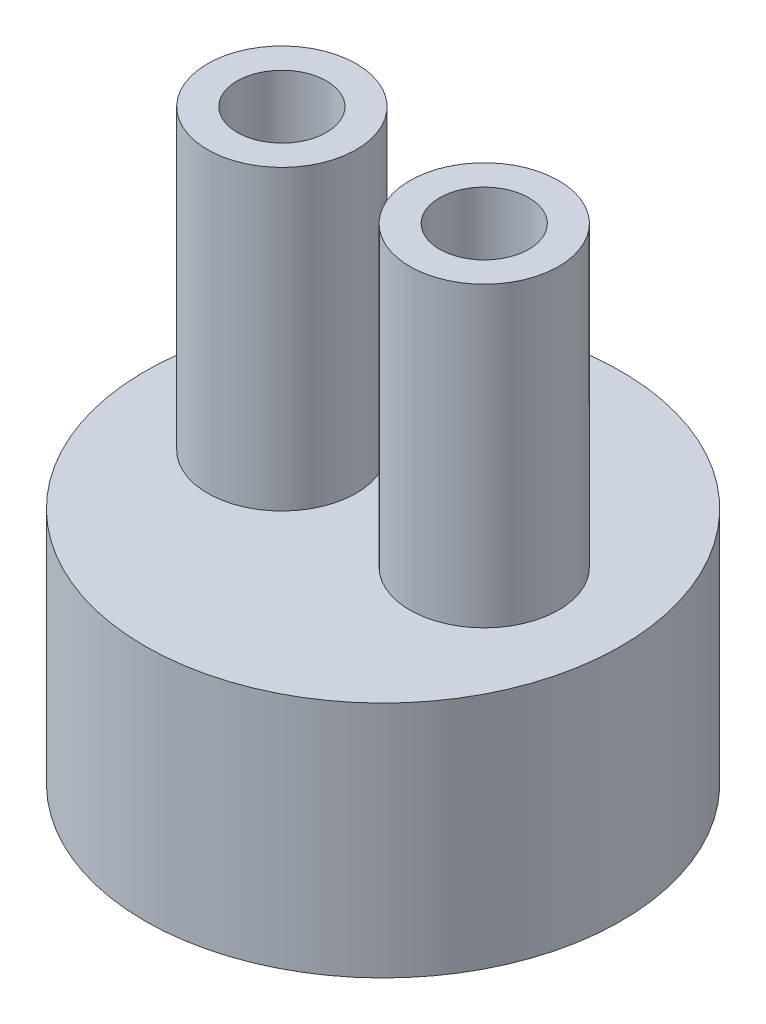
ISO-10303-21;
HEADER;
FILE_DESCRIPTION(('STEP AP214'),'2;1');
FILE_NAME('part.step','',(''),(''),'','','');
FILE_SCHEMA(('AUTOMOTIVE_DESIGN { 1 0 10303 214 1 1 1 1 }'));
ENDSEC;
DATA;
#1=APPLICATION_CONTEXT('core data for automotive mechanical design processes');
#2=APPLICATION_PROTOCOL_DEFINITION('international standard','automotive_design',2000,#1);
#3=PRODUCT_CONTEXT('',#1,'mechanical');
#4=PRODUCT('Part','Part','',(#3));
#5=PRODUCT_RELATED_PRODUCT_CATEGORY('part','',(#4));
#6=PRODUCT_DEFINITION_FORMATION('','',#4);
#7=PRODUCT_DEFINITION_CONTEXT('part definition',#1,'design');
#8=PRODUCT_DEFINITION('design','',#6,#7);
#9=PRODUCT_DEFINITION_SHAPE('','',#8);
#10=(LENGTH_UNIT() NAMED_UNIT(*) SI_UNIT(.MILLI.,.METRE.));
#11=(NAMED_UNIT(*) PLANE_ANGLE_UNIT() SI_UNIT($,.RADIAN.));
#12=(NAMED_UNIT(*) SI_UNIT($,.STERADIAN.) SOLID_ANGLE_UNIT());
#13=UNCERTAINTY_MEASURE_WITH_UNIT(LENGTH_MEASURE(1.E-05),#10,'distance_accuracy_value','');
#14=(GEOMETRIC_REPRESENTATION_CONTEXT(3) GLOBAL_UNCERTAINTY_ASSIGNED_CONTEXT((#13)) GLOBAL_UNIT_ASSIGNED_CONTEXT((#10,
#11,#12)) REPRESENTATION_CONTEXT('',''));
#15=CARTESIAN_POINT('',(0.,0.,0.));
#16=DIRECTION('',(0.,0.,1.));
#17=DIRECTION('',(1.,0.,0.));
#18=AXIS2_PLACEMENT_3D('',#15,#16,#17);
#19=CARTESIAN_POINT('',(4.318,10.083321170732,0.));
#20=DIRECTION('',(0.,1.,0.));
#21=DIRECTION('',(0.,0.,1.));
#22=AXIS2_PLACEMENT_3D('',#19,#20,#21);
#23=PLANE('',#22);
#24=CARTESIAN_POINT('',(-4.318,10.083321170732,0.));
#25=DIRECTION('',(0.,1.,0.));
#26=DIRECTION('',(0.,0.,1.));
#27=AXIS2_PLACEMENT_3D('',#24,#25,#26);
#28=CIRCLE('',#27,1.905);
#29=CARTESIAN_POINT('',(-4.318,10.083321170732,-1.905));
#30=VERTEX_POINT('',#29);
#31=EDGE_CURVE('E79',#30,#30,#28,.T.);
#32=ORIENTED_EDGE('',*,*,#31,.T.);
#33=EDGE_LOOP('',(#32));
#34=FACE_BOUND('',#33,.T.);
#35=CARTESIAN_POINT('',(4.318,10.083321170732,0.));
#36=DIRECTION('',(0.,1.,0.));
#37=DIRECTION('',(0.,0.,1.));
#38=AXIS2_PLACEMENT_3D('',#35,#36,#37);
#39=CIRCLE('',#38,1.905);
#40=CARTESIAN_POINT('',(4.318,10.083321170732,-1.905));
#41=VERTEX_POINT('',#40);
#42=EDGE_CURVE('E58',#41,#41,#39,.T.);
#43=ORIENTED_EDGE('',*,*,#42,.T.);
#44=EDGE_LOOP('',(#43));
#45=FACE_BOUND('',#44,.T.);
#46=CARTESIAN_POINT('',(0.,10.083321170732,0.));
#47=DIRECTION('',(0.,1.,0.));
#48=DIRECTION('',(0.,0.,1.));
#49=AXIS2_PLACEMENT_3D('',#46,#47,#48);
#50=CIRCLE('',#49,7.62);
#51=CARTESIAN_POINT('',(0.,10.083321170732,7.62));
#52=VERTEX_POINT('',#51);
#53=EDGE_CURVE('E10',#52,#52,#50,.T.);
#54=ORIENTED_EDGE('',*,*,#53,.F.);
#55=EDGE_LOOP('',(#54));
#56=FACE_BOUND('',#55,.T.);
#57=ADVANCED_FACE('F37',(#34,#45,#56),#23,.F.);
#58=CARTESIAN_POINT('',(4.318,25.323321170732,0.));
#59=DIRECTION('',(0.,1.,0.));
#60=DIRECTION('',(0.,0.,1.));
#61=AXIS2_PLACEMENT_3D('',#58,#59,#60);
#62=PLANE('',#61);
#63=CARTESIAN_POINT('',(4.318,25.323321170732,0.));
#64=DIRECTION('',(0.,1.,0.));
#65=DIRECTION('',(0.,0.,1.));
#66=AXIS2_PLACEMENT_3D('',#63,#64,#65);
#67=CIRCLE('',#66,3.175);
#68=CARTESIAN_POINT('',(4.318,25.323321170732,-3.175));
#69=VERTEX_POINT('',#68);
#70=EDGE_CURVE('E45',#69,#69,#67,.T.);
#71=ORIENTED_EDGE('',*,*,#70,.T.);
#72=EDGE_LOOP('',(#71));
#73=FACE_BOUND('',#72,.T.);
#74=CARTESIAN_POINT('',(4.318,25.323321170732,0.));
#75=DIRECTION('',(0.,1.,0.));
#76=DIRECTION('',(0.,0.,1.));
#77=AXIS2_PLACEMENT_3D('',#74,#75,#76);
#78=CIRCLE('',#77,1.905);
#79=CARTESIAN_POINT('',(4.318,25.323321170732,-1.905));
#80=VERTEX_POINT('',#79);
#81=EDGE_CURVE('E52',#80,#80,#78,.T.);
#82=ORIENTED_EDGE('',*,*,#81,.F.);
#83=EDGE_LOOP('',(#82));
#84=FACE_BOUND('',#83,.T.);
#85=ADVANCED_FACE('F132',(#73,#84),#62,.T.);
#86=CARTESIAN_POINT('',(4.318,25.323321170732,0.));
#87=DIRECTION('',(0.,-1.,0.));
#88=DIRECTION('',(0.,0.,-1.));
#89=AXIS2_PLACEMENT_3D('',#86,#87,#88);
#90=CYLINDRICAL_SURFACE('',#89,3.175);
#91=CARTESIAN_POINT('',(4.318,12.623321170732,0.));
#92=DIRECTION('',(0.,1.,0.));
#93=DIRECTION('',(0.,0.,1.));
#94=AXIS2_PLACEMENT_3D('',#91,#92,#93);
#95=CIRCLE('',#94,3.175);
#96=CARTESIAN_POINT('',(4.318,12.623321170732,-3.175));
#97=VERTEX_POINT('',#96);
#98=EDGE_CURVE('E70',#97,#97,#95,.T.);
#99=CARTESIAN_POINT('',(4.318,12.623321170732,-3.175));
#100=CARTESIAN_POINT('',(4.318,12.7556128373987,-3.175));
#101=CARTESIAN_POINT('',(4.318,12.8879045040654,-3.175));
#102=CARTESIAN_POINT('',(4.318,13.1524878373987,-3.175));
#103=CARTESIAN_POINT('',(4.318,13.2847795040654,-3.175));
#104=CARTESIAN_POINT('',(4.318,13.5493628373987,-3.175));
#105=CARTESIAN_POINT('',(4.318,13.6816545040654,-3.175));
#106=CARTESIAN_POINT('',(4.318,13.9462378373987,-3.175));
#107=CARTESIAN_POINT('',(4.318,14.0785295040654,-3.175));
#108=CARTESIAN_POINT('',(4.318,14.3431128373987,-3.175));
#109=CARTESIAN_POINT('',(4.318,14.4754045040654,-3.175));
#110=CARTESIAN_POINT('',(4.318,14.7399878373987,-3.175));
#111=CARTESIAN_POINT('',(4.318,14.8722795040654,-3.175));
#112=CARTESIAN_POINT('',(4.318,15.1368628373987,-3.175));
#113=CARTESIAN_POINT('',(4.318,15.2691545040654,-3.175));
#114=CARTESIAN_POINT('',(4.318,15.5337378373987,-3.175));
#115=CARTESIAN_POINT('',(4.318,15.6660295040654,-3.175));
#116=CARTESIAN_POINT('',(4.318,15.9306128373987,-3.175));
#117=CARTESIAN_POINT('',(4.318,16.0629045040654,-3.175));
#118=CARTESIAN_POINT('',(4.318,16.3274878373987,-3.175));
#119=CARTESIAN_POINT('',(4.318,16.4597795040654,-3.175));
#120=CARTESIAN_POINT('',(4.318,16.7243628373987,-3.175));
#121=CARTESIAN_POINT('',(4.318,16.8566545040654,-3.175));
#122=CARTESIAN_POINT('',(4.318,17.1212378373987,-3.175));
#123=CARTESIAN_POINT('',(4.318,17.2535295040654,-3.175));
#124=CARTESIAN_POINT('',(4.318,17.5181128373987,-3.175));
#125=CARTESIAN_POINT('',(4.318,17.6504045040654,-3.175));
#126=CARTESIAN_POINT('',(4.318,17.9149878373987,-3.175));
#127=CARTESIAN_POINT('',(4.318,18.0472795040654,-3.175));
#128=CARTESIAN_POINT('',(4.318,18.3118628373987,-3.175));
#129=CARTESIAN_POINT('',(4.318,18.4441545040654,-3.175));
#130=CARTESIAN_POINT('',(4.318,18.7087378373987,-3.175));
#131=CARTESIAN_POINT('',(4.318,18.8410295040654,-3.175));
#132=CARTESIAN_POINT('',(4.318,19.1056128373987,-3.175));
#133=CARTESIAN_POINT('',(4.318,19.2379045040654,-3.175));
#134=CARTESIAN_POINT('',(4.318,19.5024878373987,-3.175));
#135=CARTESIAN_POINT('',(4.318,19.6347795040654,-3.175));
#136=CARTESIAN_POINT('',(4.318,19.8993628373987,-3.175));
#137=CARTESIAN_POINT('',(4.318,20.0316545040654,-3.175));
#138=CARTESIAN_POINT('',(4.318,20.2962378373987,-3.175));
#139=CARTESIAN_POINT('',(4.318,20.4285295040654,-3.175));
#140=CARTESIAN_POINT('',(4.318,20.6931128373987,-3.175));
#141=CARTESIAN_POINT('',(4.318,20.8254045040654,-3.175));
#142=CARTESIAN_POINT('',(4.318,21.0899878373987,-3.175));
#143=CARTESIAN_POINT('',(4.318,21.2222795040654,-3.175));
#144=CARTESIAN_POINT('',(4.318,21.4868628373987,-3.175));
#145=CARTESIAN_POINT('',(4.318,21.6191545040654,-3.175));
#146=CARTESIAN_POINT('',(4.318,21.8837378373987,-3.175));
#147=CARTESIAN_POINT('',(4.318,22.0160295040654,-3.175));
#148=CARTESIAN_POINT('',(4.318,22.2806128373987,-3.175));
#149=CARTESIAN_POINT('',(4.318,22.4129045040654,-3.175));
#150=CARTESIAN_POINT('',(4.318,22.6774878373987,-3.175));
#151=CARTESIAN_POINT('',(4.318,22.8097795040654,-3.175));
#152=CARTESIAN_POINT('',(4.318,23.0743628373987,-3.175));
#153=CARTESIAN_POINT('',(4.318,23.2066545040654,-3.175));
#154=CARTESIAN_POINT('',(4.318,23.4712378373987,-3.175));
#155=CARTESIAN_POINT('',(4.318,23.6035295040654,-3.175));
#156=CARTESIAN_POINT('',(4.318,23.8681128373987,-3.175));
#157=CARTESIAN_POINT('',(4.318,24.0004045040654,-3.175));
#158=CARTESIAN_POINT('',(4.318,24.2649878373987,-3.175));
#159=CARTESIAN_POINT('',(4.318,24.3972795040654,-3.175));
#160=CARTESIAN_POINT('',(4.318,24.6618628373987,-3.175));
#161=CARTESIAN_POINT('',(4.318,24.7941545040654,-3.175));
#162=CARTESIAN_POINT('',(4.318,25.0587378373987,-3.175));
#163=CARTESIAN_POINT('',(4.318,25.1910295040654,-3.175));
#164=CARTESIAN_POINT('',(4.318,25.323321170732,-3.175));
#165=B_SPLINE_CURVE_WITH_KNOTS('',3,(#99,#100,#101,#102,#103,#104,#105,#106,#107,#108,#109,#110,
#111,#112,#113,#114,#115,#116,#117,#118,#119,#120,#121,#122,#123,#124,#125,#126,#127,#128,#129,
#130,#131,#132,#133,#134,#135,#136,#137,#138,#139,#140,#141,#142,#143,#144,#145,#146,#147,#148,
#149,#150,#151,#152,#153,#154,#155,#156,#157,#158,#159,#160,#161,#162,#163,#164),.UNSPECIFIED.,
.F.,.F.,(4,2,2,2,2,2,2,2,2,2,2,2,2,2,2,2,2,2,2,2,2,2,2,2,2,2,2,2,2,2,2,2,4),(0.,0.396875,
0.793749999999999,1.190625,1.5875,1.984375,2.38125,2.778125,3.175,3.571875,3.96875,4.365625,
4.7625,5.159375,5.55625,5.953125,6.35,6.746875,7.14375,7.540625,7.9375,8.334375,8.73125,
9.128125,9.525,9.921875,10.31875,10.715625,11.1125,11.509375,11.90625,12.303125,12.7),.UNSPECIFIED.);
#166=EDGE_CURVE('BSEAM39',#97,#69,#165,.T.);
#167=ORIENTED_EDGE('',*,*,#98,.T.);
#168=ORIENTED_EDGE('',*,*,#70,.F.);
#169=ORIENTED_EDGE('',*,*,#166,.T.);
#170=ORIENTED_EDGE('',*,*,#166,.F.);
#171=EDGE_LOOP('',(#167,#169,#168,#170));
#172=FACE_BOUND('',#171,.T.);
#173=ADVANCED_FACE('F39',(#172),#90,.T.);
#174=CARTESIAN_POINT('',(4.318,25.323321170732,0.));
#175=DIRECTION('',(0.,-1.,0.));
#176=DIRECTION('',(0.,0.,-1.));
#177=AXIS2_PLACEMENT_3D('',#174,#175,#176);
#178=CYLINDRICAL_SURFACE('',#177,1.905);
#179=CARTESIAN_POINT('',(4.318,25.323321170732,-1.905));
#180=CARTESIAN_POINT('',(4.318,25.164571170732,-1.905));
#181=CARTESIAN_POINT('',(4.318,25.005821170732,-1.905));
#182=CARTESIAN_POINT('',(4.318,24.688321170732,-1.905));
#183=CARTESIAN_POINT('',(4.318,24.529571170732,-1.905));
#184=CARTESIAN_POINT('',(4.318,24.212071170732,-1.905));
#185=CARTESIAN_POINT('',(4.318,24.053321170732,-1.905));
#186=CARTESIAN_POINT('',(4.318,23.735821170732,-1.905));
#187=CARTESIAN_POINT('',(4.318,23.577071170732,-1.905));
#188=CARTESIAN_POINT('',(4.318,23.259571170732,-1.905));
#189=CARTESIAN_POINT('',(4.318,23.100821170732,-1.905));
#190=CARTESIAN_POINT('',(4.318,22.783321170732,-1.905));
#191=CARTESIAN_POINT('',(4.318,22.624571170732,-1.905));
#192=CARTESIAN_POINT('',(4.318,22.307071170732,-1.905));
#193=CARTESIAN_POINT('',(4.318,22.148321170732,-1.905));
#194=CARTESIAN_POINT('',(4.318,21.830821170732,-1.905));
#195=CARTESIAN_POINT('',(4.318,21.672071170732,-1.905));
#196=CARTESIAN_POINT('',(4.318,21.354571170732,-1.905));
#197=CARTESIAN_POINT('',(4.318,21.195821170732,-1.905));
#198=CARTESIAN_POINT('',(4.318,20.878321170732,-1.905));
#199=CARTESIAN_POINT('',(4.318,20.719571170732,-1.905));
#200=CARTESIAN_POINT('',(4.318,20.402071170732,-1.905));
#201=CARTESIAN_POINT('',(4.318,20.243321170732,-1.905));
#202=CARTESIAN_POINT('',(4.318,19.925821170732,-1.905));
#203=CARTESIAN_POINT('',(4.318,19.767071170732,-1.905));
#204=CARTESIAN_POINT('',(4.318,19.449571170732,-1.905));
#205=CARTESIAN_POINT('',(4.318,19.290821170732,-1.905));
#206=CARTESIAN_POINT('',(4.318,18.973321170732,-1.905));
#207=CARTESIAN_POINT('',(4.318,18.814571170732,-1.905));
#208=CARTESIAN_POINT('',(4.318,18.497071170732,-1.905));
#209=CARTESIAN_POINT('',(4.318,18.338321170732,-1.905));
#210=CARTESIAN_POINT('',(4.318,18.020821170732,-1.905));
#211=CARTESIAN_POINT('',(4.318,17.862071170732,-1.905));
#212=CARTESIAN_POINT('',(4.318,17.544571170732,-1.905));
#213=CARTESIAN_POINT('',(4.318,17.385821170732,-1.905));
#214=CARTESIAN_POINT('',(4.318,17.068321170732,-1.905));
#215=CARTESIAN_POINT('',(4.318,16.909571170732,-1.905));
#216=CARTESIAN_POINT('',(4.318,16.592071170732,-1.905));
#217=CARTESIAN_POINT('',(4.318,16.433321170732,-1.905));
#218=CARTESIAN_POINT('',(4.318,16.115821170732,-1.905));
#219=CARTESIAN_POINT('',(4.318,15.957071170732,-1.905));
#220=CARTESIAN_POINT('',(4.318,15.639571170732,-1.905));
#221=CARTESIAN_POINT('',(4.318,15.480821170732,-1.905));
#222=CARTESIAN_POINT('',(4.318,15.163321170732,-1.905));
#223=CARTESIAN_POINT('',(4.318,15.004571170732,-1.905));
#224=CARTESIAN_POINT('',(4.318,14.687071170732,-1.905));
#225=CARTESIAN_POINT('',(4.318,14.528321170732,-1.905));
#226=CARTESIAN_POINT('',(4.318,14.210821170732,-1.905));
#227=CARTESIAN_POINT('',(4.318,14.052071170732,-1.905));
#228=CARTESIAN_POINT('',(4.318,13.734571170732,-1.905));
#229=CARTESIAN_POINT('',(4.318,13.575821170732,-1.905));
#230=CARTESIAN_POINT('',(4.318,13.258321170732,-1.905));
#231=CARTESIAN_POINT('',(4.318,13.099571170732,-1.905));
#232=CARTESIAN_POINT('',(4.318,12.782071170732,-1.905));
#233=CARTESIAN_POINT('',(4.318,12.623321170732,-1.905));
#234=CARTESIAN_POINT('',(4.318,12.305821170732,-1.905));
#235=CARTESIAN_POINT('',(4.318,12.147071170732,-1.905));
#236=CARTESIAN_POINT('',(4.318,11.829571170732,-1.905));
#237=CARTESIAN_POINT('',(4.318,11.670821170732,-1.905));
#238=CARTESIAN_POINT('',(4.318,11.353321170732,-1.905));
#239=CARTESIAN_POINT('',(4.318,11.194571170732,-1.905));
#240=CARTESIAN_POINT('',(4.318,10.877071170732,-1.905));
#241=CARTESIAN_POINT('',(4.318,10.718321170732,-1.905));
#242=CARTESIAN_POINT('',(4.318,10.400821170732,-1.905));
#243=CARTESIAN_POINT('',(4.318,10.242071170732,-1.905));
#244=CARTESIAN_POINT('',(4.318,10.083321170732,-1.905));
#245=B_SPLINE_CURVE_WITH_KNOTS('',3,(#179,#180,#181,#182,#183,#184,#185,#186,#187,#188,#189,
#190,#191,#192,#193,#194,#195,#196,#197,#198,#199,#200,#201,#202,#203,#204,#205,#206,#207,#208,
#209,#210,#211,#212,#213,#214,#215,#216,#217,#218,#219,#220,#221,#222,#223,#224,#225,#226,#227,
#228,#229,#230,#231,#232,#233,#234,#235,#236,#237,#238,#239,#240,#241,#242,#243,#244),
.UNSPECIFIED.,.F.,.F.,(4,2,2,2,2,2,2,2,2,2,2,2,2,2,2,2,2,2,2,2,2,2,2,2,2,2,2,2,2,2,2,2,4),(0.,
0.476250000000001,0.952500000000002,1.42875,1.905,2.38125,2.8575,3.33375,3.81,4.28625,4.7625,
5.23875,5.715,6.19125,6.6675,7.14375,7.62,8.09625,8.5725,9.04875,9.525,10.00125,10.4775,
10.95375,11.43,11.90625,12.3825,12.85875,13.335,13.81125,14.2875,14.76375,15.24),.UNSPECIFIED.);
#246=EDGE_CURVE('BSEAM126',#80,#41,#245,.T.);
#247=ORIENTED_EDGE('',*,*,#81,.T.);
#248=ORIENTED_EDGE('',*,*,#42,.F.);
#249=ORIENTED_EDGE('',*,*,#246,.T.);
#250=ORIENTED_EDGE('',*,*,#246,.F.);
#251=EDGE_LOOP('',(#247,#249,#248,#250));
#252=FACE_BOUND('',#251,.T.);
#253=ADVANCED_FACE('F126',(#252),#178,.F.);
#254=CARTESIAN_POINT('',(0.,12.623321170732,0.));
#255=DIRECTION('',(0.,1.,0.));
#256=DIRECTION('',(0.,0.,1.));
#257=AXIS2_PLACEMENT_3D('',#254,#255,#256);
#258=PLANE('',#257);
#259=CARTESIAN_POINT('',(-4.318,12.623321170732,0.));
#260=DIRECTION('',(0.,1.,0.));
#261=DIRECTION('',(0.,0.,1.));
#262=AXIS2_PLACEMENT_3D('',#259,#260,#261);
#263=CIRCLE('',#262,3.175);
#264=CARTESIAN_POINT('',(-4.318,12.623321170732,-3.175));
#265=VERTEX_POINT('',#264);
#266=EDGE_CURVE('E67',#265,#265,#263,.T.);
#267=ORIENTED_EDGE('',*,*,#266,.F.);
#268=EDGE_LOOP('',(#267));
#269=FACE_BOUND('',#268,.T.);
#270=CARTESIAN_POINT('',(0.,12.623321170732,0.));
#271=DIRECTION('',(0.,1.,0.));
#272=DIRECTION('',(0.,0.,1.));
#273=AXIS2_PLACEMENT_3D('',#270,#271,#272);
#274=CIRCLE('',#273,10.16);
#275=CARTESIAN_POINT('',(0.,12.623321170732,10.16));
#276=VERTEX_POINT('',#275);
#277=EDGE_CURVE('E63',#276,#276,#274,.T.);
#278=ORIENTED_EDGE('',*,*,#277,.T.);
#279=EDGE_LOOP('',(#278));
#280=FACE_BOUND('',#279,.T.);
#281=ORIENTED_EDGE('',*,*,#98,.F.);
#282=EDGE_LOOP('',(#281));
#283=FACE_BOUND('',#282,.T.);
#284=ADVANCED_FACE('F116',(#269,#280,#283),#258,.T.);
#285=CARTESIAN_POINT('',(0.,12.623321170732,0.));
#286=DIRECTION('',(0.,-1.,0.));
#287=DIRECTION('',(0.,0.,-1.));
#288=AXIS2_PLACEMENT_3D('',#285,#286,#287);
#289=CYLINDRICAL_SURFACE('',#288,10.16);
#290=ORIENTED_EDGE('',*,*,#277,.F.);
#291=EDGE_LOOP('',(#290));
#292=FACE_BOUND('',#291,.T.);
#293=CARTESIAN_POINT('',(0.,2.46332117073202,0.));
#294=DIRECTION('',(0.,1.,0.));
#295=DIRECTION('',(0.,0.,1.));
#296=AXIS2_PLACEMENT_3D('',#293,#294,#295);
#297=CIRCLE('',#296,10.16);
#298=CARTESIAN_POINT('',(0.,2.46332117073202,10.16));
#299=VERTEX_POINT('',#298);
#300=EDGE_CURVE('E83',#299,#299,#297,.T.);
#301=ORIENTED_EDGE('',*,*,#300,.T.);
#302=EDGE_LOOP('',(#301));
#303=FACE_BOUND('',#302,.T.);
#304=ADVANCED_FACE('F113',(#292,#303),#289,.T.);
#305=CARTESIAN_POINT('',(-4.318,25.323321170732,0.));
#306=DIRECTION('',(0.,1.,0.));
#307=DIRECTION('',(0.,0.,1.));
#308=AXIS2_PLACEMENT_3D('',#305,#306,#307);
#309=PLANE('',#308);
#310=CARTESIAN_POINT('',(-4.318,25.323321170732,0.));
#311=DIRECTION('',(0.,1.,0.));
#312=DIRECTION('',(0.,0.,1.));
#313=AXIS2_PLACEMENT_3D('',#310,#311,#312);
#314=CIRCLE('',#313,3.175);
#315=CARTESIAN_POINT('',(-4.318,25.323321170732,-3.175));
#316=VERTEX_POINT('',#315);
#317=EDGE_CURVE('E74',#316,#316,#314,.T.);
#318=ORIENTED_EDGE('',*,*,#317,.T.);
#319=EDGE_LOOP('',(#318));
#320=FACE_BOUND('',#319,.T.);
#321=CARTESIAN_POINT('',(-4.318,25.323321170732,0.));
#322=DIRECTION('',(0.,1.,0.));
#323=DIRECTION('',(0.,0.,1.));
#324=AXIS2_PLACEMENT_3D('',#321,#322,#323);
#325=CIRCLE('',#324,1.905);
#326=CARTESIAN_POINT('',(-4.318,25.323321170732,-1.905));
#327=VERTEX_POINT('',#326);
#328=EDGE_CURVE('E78',#327,#327,#325,.T.);
#329=ORIENTED_EDGE('',*,*,#328,.F.);
#330=EDGE_LOOP('',(#329));
#331=FACE_BOUND('',#330,.T.);
#332=ADVANCED_FACE('F115',(#320,#331),#309,.T.);
#333=CARTESIAN_POINT('',(-4.318,25.323321170732,0.));
#334=DIRECTION('',(0.,-1.,0.));
#335=DIRECTION('',(0.,0.,-1.));
#336=AXIS2_PLACEMENT_3D('',#333,#334,#335);
#337=CYLINDRICAL_SURFACE('',#336,3.175);
#338=CARTESIAN_POINT('',(-4.318,12.623321170732,-3.175));
#339=CARTESIAN_POINT('',(-4.318,12.7556128373987,-3.175));
#340=CARTESIAN_POINT('',(-4.318,12.8879045040654,-3.175));
#341=CARTESIAN_POINT('',(-4.318,13.1524878373987,-3.175));
#342=CARTESIAN_POINT('',(-4.318,13.2847795040654,-3.175));
#343=CARTESIAN_POINT('',(-4.318,13.5493628373987,-3.175));
#344=CARTESIAN_POINT('',(-4.318,13.6816545040654,-3.175));
#345=CARTESIAN_POINT('',(-4.318,13.9462378373987,-3.175));
#346=CARTESIAN_POINT('',(-4.318,14.0785295040654,-3.175));
#347=CARTESIAN_POINT('',(-4.318,14.3431128373987,-3.175));
#348=CARTESIAN_POINT('',(-4.318,14.4754045040654,-3.175));
#349=CARTESIAN_POINT('',(-4.318,14.7399878373987,-3.175));
#350=CARTESIAN_POINT('',(-4.318,14.8722795040654,-3.175));
#351=CARTESIAN_POINT('',(-4.318,15.1368628373987,-3.175));
#352=CARTESIAN_POINT('',(-4.318,15.2691545040654,-3.175));
#353=CARTESIAN_POINT('',(-4.318,15.5337378373987,-3.175));
#354=CARTESIAN_POINT('',(-4.318,15.6660295040654,-3.175));
#355=CARTESIAN_POINT('',(-4.318,15.9306128373987,-3.175));
#356=CARTESIAN_POINT('',(-4.318,16.0629045040654,-3.175));
#357=CARTESIAN_POINT('',(-4.318,16.3274878373987,-3.175));
#358=CARTESIAN_POINT('',(-4.318,16.4597795040654,-3.175));
#359=CARTESIAN_POINT('',(-4.318,16.7243628373987,-3.175));
#360=CARTESIAN_POINT('',(-4.318,16.8566545040654,-3.175));
#361=CARTESIAN_POINT('',(-4.318,17.1212378373987,-3.175));
#362=CARTESIAN_POINT('',(-4.318,17.2535295040654,-3.175));
#363=CARTESIAN_POINT('',(-4.318,17.5181128373987,-3.175));
#364=CARTESIAN_POINT('',(-4.318,17.6504045040654,-3.175));
#365=CARTESIAN_POINT('',(-4.318,17.9149878373987,-3.175));
#366=CARTESIAN_POINT('',(-4.318,18.0472795040654,-3.175));
#367=CARTESIAN_POINT('',(-4.318,18.3118628373987,-3.175));
#368=CARTESIAN_POINT('',(-4.318,18.4441545040654,-3.175));
#369=CARTESIAN_POINT('',(-4.318,18.7087378373987,-3.175));
#370=CARTESIAN_POINT('',(-4.318,18.8410295040654,-3.175));
#371=CARTESIAN_POINT('',(-4.318,19.1056128373987,-3.175));
#372=CARTESIAN_POINT('',(-4.318,19.2379045040654,-3.175));
#373=CARTESIAN_POINT('',(-4.318,19.5024878373987,-3.175));
#374=CARTESIAN_POINT('',(-4.318,19.6347795040654,-3.175));
#375=CARTESIAN_POINT('',(-4.318,19.8993628373987,-3.175));
#376=CARTESIAN_POINT('',(-4.318,20.0316545040654,-3.175));
#377=CARTESIAN_POINT('',(-4.318,20.2962378373987,-3.175));
#378=CARTESIAN_POINT('',(-4.318,20.4285295040654,-3.175));
#379=CARTESIAN_POINT('',(-4.318,20.6931128373987,-3.175));
#380=CARTESIAN_POINT('',(-4.318,20.8254045040654,-3.175));
#381=CARTESIAN_POINT('',(-4.318,21.0899878373987,-3.175));
#382=CARTESIAN_POINT('',(-4.318,21.2222795040654,-3.175));
#383=CARTESIAN_POINT('',(-4.318,21.4868628373987,-3.175));
#384=CARTESIAN_POINT('',(-4.318,21.6191545040654,-3.175));
#385=CARTESIAN_POINT('',(-4.318,21.8837378373987,-3.175));
#386=CARTESIAN_POINT('',(-4.318,22.0160295040654,-3.175));
#387=CARTESIAN_POINT('',(-4.318,22.2806128373987,-3.175));
#388=CARTESIAN_POINT('',(-4.318,22.4129045040654,-3.175));
#389=CARTESIAN_POINT('',(-4.318,22.6774878373987,-3.175));
#390=CARTESIAN_POINT('',(-4.318,22.8097795040654,-3.175));
#391=CARTESIAN_POINT('',(-4.318,23.0743628373987,-3.175));
#392=CARTESIAN_POINT('',(-4.318,23.2066545040654,-3.175));
#393=CARTESIAN_POINT('',(-4.318,23.4712378373987,-3.175));
#394=CARTESIAN_POINT('',(-4.318,23.6035295040654,-3.175));
#395=CARTESIAN_POINT('',(-4.318,23.8681128373987,-3.175));
#396=CARTESIAN_POINT('',(-4.318,24.0004045040654,-3.175));
#397=CARTESIAN_POINT('',(-4.318,24.2649878373987,-3.175));
#398=CARTESIAN_POINT('',(-4.318,24.3972795040654,-3.175));
#399=CARTESIAN_POINT('',(-4.318,24.6618628373987,-3.175));
#400=CARTESIAN_POINT('',(-4.318,24.7941545040654,-3.175));
#401=CARTESIAN_POINT('',(-4.318,25.0587378373987,-3.175));
#402=CARTESIAN_POINT('',(-4.318,25.1910295040654,-3.175));
#403=CARTESIAN_POINT('',(-4.318,25.323321170732,-3.175));
#404=B_SPLINE_CURVE_WITH_KNOTS('',3,(#338,#339,#340,#341,#342,#343,#344,#345,#346,#347,#348,
#349,#350,#351,#352,#353,#354,#355,#356,#357,#358,#359,#360,#361,#362,#363,#364,#365,#366,#367,
#368,#369,#370,#371,#372,#373,#374,#375,#376,#377,#378,#379,#380,#381,#382,#383,#384,#385,#386,
#387,#388,#389,#390,#391,#392,#393,#394,#395,#396,#397,#398,#399,#400,#401,#402,#403),
.UNSPECIFIED.,.F.,.F.,(4,2,2,2,2,2,2,2,2,2,2,2,2,2,2,2,2,2,2,2,2,2,2,2,2,2,2,2,2,2,2,2,4),(0.,
0.396875,0.793749999999999,1.190625,1.5875,1.984375,2.38125,2.778125,3.175,3.571875,3.96875,
4.365625,4.7625,5.159375,5.55625,5.953125,6.35,6.746875,7.14375,7.540625,7.9375,8.334375,
8.73125,9.128125,9.525,9.921875,10.31875,10.715625,11.1125,11.509375,11.90625,12.303125,12.7),.UNSPECIFIED.);
#405=EDGE_CURVE('BSEAM123',#265,#316,#404,.T.);
#406=ORIENTED_EDGE('',*,*,#266,.T.);
#407=ORIENTED_EDGE('',*,*,#317,.F.);
#408=ORIENTED_EDGE('',*,*,#405,.T.);
#409=ORIENTED_EDGE('',*,*,#405,.F.);
#410=EDGE_LOOP('',(#406,#408,#407,#409));
#411=FACE_BOUND('',#410,.T.);
#412=ADVANCED_FACE('F123',(#411),#337,.T.);
#413=CARTESIAN_POINT('',(-4.318,25.323321170732,0.));
#414=DIRECTION('',(0.,-1.,0.));
#415=DIRECTION('',(0.,0.,-1.));
#416=AXIS2_PLACEMENT_3D('',#413,#414,#415);
#417=CYLINDRICAL_SURFACE('',#416,1.905);
#418=CARTESIAN_POINT('',(-4.318,25.323321170732,-1.905));
#419=CARTESIAN_POINT('',(-4.318,25.164571170732,-1.905));
#420=CARTESIAN_POINT('',(-4.318,25.005821170732,-1.905));
#421=CARTESIAN_POINT('',(-4.318,24.688321170732,-1.905));
#422=CARTESIAN_POINT('',(-4.318,24.529571170732,-1.905));
#423=CARTESIAN_POINT('',(-4.318,24.212071170732,-1.905));
#424=CARTESIAN_POINT('',(-4.318,24.053321170732,-1.905));
#425=CARTESIAN_POINT('',(-4.318,23.735821170732,-1.905));
#426=CARTESIAN_POINT('',(-4.318,23.577071170732,-1.905));
#427=CARTESIAN_POINT('',(-4.318,23.259571170732,-1.905));
#428=CARTESIAN_POINT('',(-4.318,23.100821170732,-1.905));
#429=CARTESIAN_POINT('',(-4.318,22.783321170732,-1.905));
#430=CARTESIAN_POINT('',(-4.318,22.624571170732,-1.905));
#431=CARTESIAN_POINT('',(-4.318,22.307071170732,-1.905));
#432=CARTESIAN_POINT('',(-4.318,22.148321170732,-1.905));
#433=CARTESIAN_POINT('',(-4.318,21.830821170732,-1.905));
#434=CARTESIAN_POINT('',(-4.318,21.672071170732,-1.905));
#435=CARTESIAN_POINT('',(-4.318,21.354571170732,-1.905));
#436=CARTESIAN_POINT('',(-4.318,21.195821170732,-1.905));
#437=CARTESIAN_POINT('',(-4.318,20.878321170732,-1.905));
#438=CARTESIAN_POINT('',(-4.318,20.719571170732,-1.905));
#439=CARTESIAN_POINT('',(-4.318,20.402071170732,-1.905));
#440=CARTESIAN_POINT('',(-4.318,20.243321170732,-1.905));
#441=CARTESIAN_POINT('',(-4.318,19.925821170732,-1.905));
#442=CARTESIAN_POINT('',(-4.318,19.767071170732,-1.905));
#443=CARTESIAN_POINT('',(-4.318,19.449571170732,-1.905));
#444=CARTESIAN_POINT('',(-4.318,19.290821170732,-1.905));
#445=CARTESIAN_POINT('',(-4.318,18.973321170732,-1.905));
#446=CARTESIAN_POINT('',(-4.318,18.814571170732,-1.905));
#447=CARTESIAN_POINT('',(-4.318,18.497071170732,-1.905));
#448=CARTESIAN_POINT('',(-4.318,18.338321170732,-1.905));
#449=CARTESIAN_POINT('',(-4.318,18.020821170732,-1.905));
#450=CARTESIAN_POINT('',(-4.318,17.862071170732,-1.905));
#451=CARTESIAN_POINT('',(-4.318,17.544571170732,-1.905));
#452=CARTESIAN_POINT('',(-4.318,17.385821170732,-1.905));
#453=CARTESIAN_POINT('',(-4.318,17.068321170732,-1.905));
#454=CARTESIAN_POINT('',(-4.318,16.909571170732,-1.905));
#455=CARTESIAN_POINT('',(-4.318,16.592071170732,-1.905));
#456=CARTESIAN_POINT('',(-4.318,16.433321170732,-1.905));
#457=CARTESIAN_POINT('',(-4.318,16.115821170732,-1.905));
#458=CARTESIAN_POINT('',(-4.318,15.957071170732,-1.905));
#459=CARTESIAN_POINT('',(-4.318,15.639571170732,-1.905));
#460=CARTESIAN_POINT('',(-4.318,15.480821170732,-1.905));
#461=CARTESIAN_POINT('',(-4.318,15.163321170732,-1.905));
#462=CARTESIAN_POINT('',(-4.318,15.004571170732,-1.905));
#463=CARTESIAN_POINT('',(-4.318,14.687071170732,-1.905));
#464=CARTESIAN_POINT('',(-4.318,14.528321170732,-1.905));
#465=CARTESIAN_POINT('',(-4.318,14.210821170732,-1.905));
#466=CARTESIAN_POINT('',(-4.318,14.052071170732,-1.905));
#467=CARTESIAN_POINT('',(-4.318,13.734571170732,-1.905));
#468=CARTESIAN_POINT('',(-4.318,13.575821170732,-1.905));
#469=CARTESIAN_POINT('',(-4.318,13.258321170732,-1.905));
#470=CARTESIAN_POINT('',(-4.318,13.099571170732,-1.905));
#471=CARTESIAN_POINT('',(-4.318,12.782071170732,-1.905));
#472=CARTESIAN_POINT('',(-4.318,12.623321170732,-1.905));
#473=CARTESIAN_POINT('',(-4.318,12.305821170732,-1.905));
#474=CARTESIAN_POINT('',(-4.318,12.147071170732,-1.905));
#475=CARTESIAN_POINT('',(-4.318,11.829571170732,-1.905));
#476=CARTESIAN_POINT('',(-4.318,11.670821170732,-1.905));
#477=CARTESIAN_POINT('',(-4.318,11.353321170732,-1.905));
#478=CARTESIAN_POINT('',(-4.318,11.194571170732,-1.905));
#479=CARTESIAN_POINT('',(-4.318,10.877071170732,-1.905));
#480=CARTESIAN_POINT('',(-4.318,10.718321170732,-1.905));
#481=CARTESIAN_POINT('',(-4.318,10.400821170732,-1.905));
#482=CARTESIAN_POINT('',(-4.318,10.242071170732,-1.905));
#483=CARTESIAN_POINT('',(-4.318,10.083321170732,-1.905));
#484=B_SPLINE_CURVE_WITH_KNOTS('',3,(#418,#419,#420,#421,#422,#423,#424,#425,#426,#427,#428,
#429,#430,#431,#432,#433,#434,#435,#436,#437,#438,#439,#440,#441,#442,#443,#444,#445,#446,#447,
#448,#449,#450,#451,#452,#453,#454,#455,#456,#457,#458,#459,#460,#461,#462,#463,#464,#465,#466,
#467,#468,#469,#470,#471,#472,#473,#474,#475,#476,#477,#478,#479,#480,#481,#482,#483),
.UNSPECIFIED.,.F.,.F.,(4,2,2,2,2,2,2,2,2,2,2,2,2,2,2,2,2,2,2,2,2,2,2,2,2,2,2,2,2,2,2,2,4),(0.,
0.476250000000001,0.952500000000002,1.42875,1.905,2.38125,2.8575,3.33375,3.81,4.28625,4.7625,
5.23875,5.715,6.19125,6.6675,7.14375,7.62,8.09625,8.5725,9.04875,9.525,10.00125,10.4775,
10.95375,11.43,11.90625,12.3825,12.85875,13.335,13.81125,14.2875,14.76375,15.24),.UNSPECIFIED.);
#485=EDGE_CURVE('BSEAM109',#327,#30,#484,.T.);
#486=ORIENTED_EDGE('',*,*,#328,.T.);
#487=ORIENTED_EDGE('',*,*,#31,.F.);
#488=ORIENTED_EDGE('',*,*,#485,.T.);
#489=ORIENTED_EDGE('',*,*,#485,.F.);
#490=EDGE_LOOP('',(#486,#488,#487,#489));
#491=FACE_BOUND('',#490,.T.);
#492=ADVANCED_FACE('F109',(#491),#417,.F.);
#493=CARTESIAN_POINT('',(0.,2.46332117073202,0.));
#494=DIRECTION('',(0.,1.,0.));
#495=DIRECTION('',(0.,0.,1.));
#496=AXIS2_PLACEMENT_3D('',#493,#494,#495);
#497=CONICAL_SURFACE('',#496,10.16,1.22173047639602);
#498=CARTESIAN_POINT('',(0.,0.,0.));
#499=DIRECTION('',(0.,-1.,0.));
#500=DIRECTION('',(0.,0.,-1.));
#501=AXIS2_PLACEMENT_3D('',#498,#499,#500);
#502=CIRCLE('',#501,3.39208070654947);
#503=CARTESIAN_POINT('',(0.,0.,-3.39208070654947));
#504=VERTEX_POINT('',#503);
#505=EDGE_CURVE('E97',#504,#504,#502,.T.);
#506=ORIENTED_EDGE('',*,*,#505,.F.);
#507=EDGE_LOOP('',(#506));
#508=FACE_BOUND('',#507,.T.);
#509=ORIENTED_EDGE('',*,*,#300,.F.);
#510=EDGE_LOOP('',(#509));
#511=FACE_BOUND('',#510,.T.);
#512=ADVANCED_FACE('F105',(#508,#511),#497,.T.);
#513=CARTESIAN_POINT('',(0.,4.85014042752822,0.));
#514=DIRECTION('',(0.,1.,0.));
#515=DIRECTION('',(0.,0.,1.));
#516=AXIS2_PLACEMENT_3D('',#513,#514,#515);
#517=CONICAL_SURFACE('',#516,9.29126883595278,1.22173047639602);
#518=CARTESIAN_POINT('',(0.,2.70301154208885,0.));
#519=DIRECTION('',(0.,1.,0.));
#520=DIRECTION('',(0.,0.,1.));
#521=AXIS2_PLACEMENT_3D('',#518,#519,#520);
#522=CIRCLE('',#521,3.39208070654947);
#523=CARTESIAN_POINT('',(0.,2.70301154208885,3.39208070654947));
#524=VERTEX_POINT('',#523);
#525=EDGE_CURVE('E93',#524,#524,#522,.T.);
#526=ORIENTED_EDGE('',*,*,#525,.F.);
#527=EDGE_LOOP('',(#526));
#528=FACE_BOUND('',#527,.T.);
#529=CARTESIAN_POINT('',(0.,4.24184831778467,0.));
#530=DIRECTION('',(0.,1.,0.));
#531=DIRECTION('',(0.,0.,1.));
#532=AXIS2_PLACEMENT_3D('',#529,#530,#531);
#533=CIRCLE('',#532,7.62);
#534=CARTESIAN_POINT('',(0.,4.24184831778467,7.62));
#535=VERTEX_POINT('',#534);
#536=EDGE_CURVE('E89',#535,#535,#533,.T.);
#537=ORIENTED_EDGE('',*,*,#536,.T.);
#538=EDGE_LOOP('',(#537));
#539=FACE_BOUND('',#538,.T.);
#540=ADVANCED_FACE('F108',(#528,#539),#517,.F.);
#541=CARTESIAN_POINT('',(0.,10.083321170732,0.));
#542=DIRECTION('',(0.,1.,0.));
#543=DIRECTION('',(0.,0.,1.));
#544=AXIS2_PLACEMENT_3D('',#541,#542,#543);
#545=CYLINDRICAL_SURFACE('',#544,7.62);
#546=ORIENTED_EDGE('',*,*,#536,.F.);
#547=EDGE_LOOP('',(#546));
#548=FACE_BOUND('',#547,.T.);
#549=ORIENTED_EDGE('',*,*,#53,.T.);
#550=EDGE_LOOP('',(#549));
#551=FACE_BOUND('',#550,.T.);
#552=ADVANCED_FACE('F182',(#548,#551),#545,.F.);
#553=CARTESIAN_POINT('',(0.,25.324321170732,0.));
#554=DIRECTION('',(0.,-1.,0.));
#555=DIRECTION('',(0.,0.,-1.));
#556=AXIS2_PLACEMENT_3D('',#553,#554,#555);
#557=CYLINDRICAL_SURFACE('',#556,3.39208070654947);
#558=ORIENTED_EDGE('',*,*,#505,.T.);
#559=EDGE_LOOP('',(#558));
#560=FACE_BOUND('',#559,.T.);
#561=ORIENTED_EDGE('',*,*,#525,.T.);
#562=EDGE_LOOP('',(#561));
#563=FACE_BOUND('',#562,.T.);
#564=ADVANCED_FACE('F102',(#560,#563),#557,.F.);
#565=CLOSED_SHELL('',(#57,#85,#173,#253,#284,#304,#332,#412,#492,#512,#540,#552,#564));
#566=MANIFOLD_SOLID_BREP('B2',#565);
#567=ADVANCED_BREP_SHAPE_REPRESENTATION('',(#18,#566),#14);
#568=SHAPE_DEFINITION_REPRESENTATION(#9,#567);
ENDSEC;
END-ISO-10303-21;
